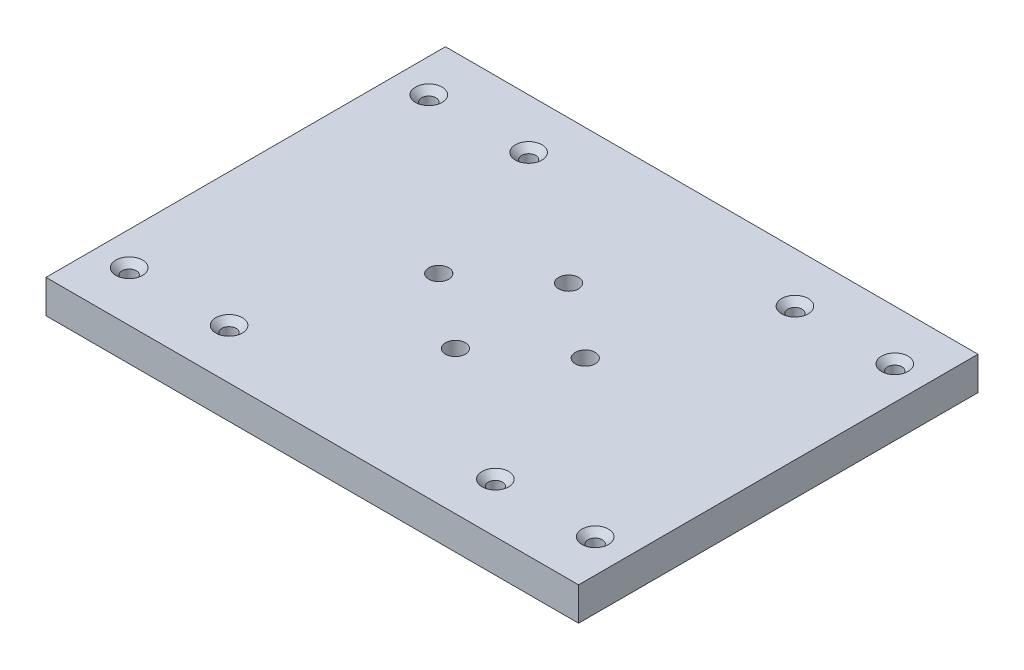
ISO-10303-21;
HEADER;
FILE_DESCRIPTION(('STEP AP214'),'2;1');
FILE_NAME('part.step','',(''),(''),'','','');
FILE_SCHEMA(('AUTOMOTIVE_DESIGN { 1 0 10303 214 1 1 1 1 }'));
ENDSEC;
DATA;
#1=APPLICATION_CONTEXT('core data for automotive mechanical design processes');
#2=APPLICATION_PROTOCOL_DEFINITION('international standard','automotive_design',2000,#1);
#3=PRODUCT_CONTEXT('',#1,'mechanical');
#4=PRODUCT('Part','Part','',(#3));
#5=PRODUCT_RELATED_PRODUCT_CATEGORY('part','',(#4));
#6=PRODUCT_DEFINITION_FORMATION('','',#4);
#7=PRODUCT_DEFINITION_CONTEXT('part definition',#1,'design');
#8=PRODUCT_DEFINITION('design','',#6,#7);
#9=PRODUCT_DEFINITION_SHAPE('','',#8);
#10=(LENGTH_UNIT() NAMED_UNIT(*) SI_UNIT(.MILLI.,.METRE.));
#11=(NAMED_UNIT(*) PLANE_ANGLE_UNIT() SI_UNIT($,.RADIAN.));
#12=(NAMED_UNIT(*) SI_UNIT($,.STERADIAN.) SOLID_ANGLE_UNIT());
#13=UNCERTAINTY_MEASURE_WITH_UNIT(LENGTH_MEASURE(1.E-05),#10,'distance_accuracy_value','');
#14=(GEOMETRIC_REPRESENTATION_CONTEXT(3) GLOBAL_UNCERTAINTY_ASSIGNED_CONTEXT((#13)) GLOBAL_UNIT_ASSIGNED_CONTEXT((#10,
#11,#12)) REPRESENTATION_CONTEXT('',''));
#15=CARTESIAN_POINT('',(0.,0.,0.));
#16=DIRECTION('',(0.,0.,1.));
#17=DIRECTION('',(1.,0.,0.));
#18=AXIS2_PLACEMENT_3D('',#15,#16,#17);
#19=CARTESIAN_POINT('',(-70.,9.99999999993406,-45.));
#20=DIRECTION('',(0.,1.,0.));
#21=DIRECTION('',(0.,0.,1.));
#22=AXIS2_PLACEMENT_3D('',#19,#20,#21);
#23=CONICAL_SURFACE('',#22,4.00000000000318,0.785398163397448);
#24=CARTESIAN_POINT('',(-70.,10.0000000000477,-45.));
#25=DIRECTION('',(0.,1.,0.));
#26=DIRECTION('',(0.,0.,1.));
#27=AXIS2_PLACEMENT_3D('',#24,#25,#26);
#28=CIRCLE('',#27,4.00000000011687);
#29=CARTESIAN_POINT('',(-70.,10.0000000000477,-40.9999999998831));
#30=VERTEX_POINT('',#29);
#31=EDGE_CURVE('E19',#30,#30,#28,.F.);
#32=ORIENTED_EDGE('',*,*,#31,.F.);
#33=EDGE_LOOP('',(#32));
#34=FACE_BOUND('',#33,.T.);
#35=CARTESIAN_POINT('',(-70.,8.15,-45.));
#36=DIRECTION('',(0.,1.,0.));
#37=DIRECTION('',(0.,0.,1.));
#38=AXIS2_PLACEMENT_3D('',#35,#36,#37);
#39=CIRCLE('',#38,2.15);
#40=CARTESIAN_POINT('',(-70.,8.15,-42.85));
#41=VERTEX_POINT('',#40);
#42=EDGE_CURVE('E129',#41,#41,#39,.F.);
#43=ORIENTED_EDGE('',*,*,#42,.T.);
#44=EDGE_LOOP('',(#43));
#45=FACE_BOUND('',#44,.T.);
#46=ADVANCED_FACE('F16',(#34,#45),#23,.F.);
#47=CARTESIAN_POINT('',(-40.,9.99999999999091,-45.));
#48=DIRECTION('',(0.,1.,0.));
#49=DIRECTION('',(0.,0.,1.));
#50=AXIS2_PLACEMENT_3D('',#47,#48,#49);
#51=CONICAL_SURFACE('',#50,4.00000000000318,0.785398163382085);
#52=CARTESIAN_POINT('',(-40.,9.99999999999091,-45.));
#53=DIRECTION('',(0.,1.,0.));
#54=DIRECTION('',(0.,0.,1.));
#55=AXIS2_PLACEMENT_3D('',#52,#53,#54);
#56=CIRCLE('',#55,4.00000000000318);
#57=CARTESIAN_POINT('',(-40.,9.99999999999091,-40.9999999999968));
#58=VERTEX_POINT('',#57);
#59=EDGE_CURVE('E192',#58,#58,#56,.F.);
#60=ORIENTED_EDGE('',*,*,#59,.F.);
#61=EDGE_LOOP('',(#60));
#62=FACE_BOUND('',#61,.T.);
#63=CARTESIAN_POINT('',(-40.,8.15,-45.));
#64=DIRECTION('',(0.,1.,0.));
#65=DIRECTION('',(0.,0.,1.));
#66=AXIS2_PLACEMENT_3D('',#63,#64,#65);
#67=CIRCLE('',#66,2.15);
#68=CARTESIAN_POINT('',(-40.,8.15,-42.85));
#69=VERTEX_POINT('',#68);
#70=EDGE_CURVE('E126',#69,#69,#67,.F.);
#71=ORIENTED_EDGE('',*,*,#70,.T.);
#72=EDGE_LOOP('',(#71));
#73=FACE_BOUND('',#72,.T.);
#74=ADVANCED_FACE('F202',(#62,#73),#51,.F.);
#75=CARTESIAN_POINT('',(40.,9.99999999999091,-45.0000000000001));
#76=DIRECTION('',(0.,1.,0.));
#77=DIRECTION('',(0.,0.,1.));
#78=AXIS2_PLACEMENT_3D('',#75,#76,#77);
#79=CONICAL_SURFACE('',#78,4.00000000000325,0.785398163382085);
#80=CARTESIAN_POINT('',(40.,9.99999999999091,-45.0000000000001));
#81=DIRECTION('',(0.,1.,0.));
#82=DIRECTION('',(0.,0.,1.));
#83=AXIS2_PLACEMENT_3D('',#80,#81,#82);
#84=CIRCLE('',#83,4.00000000000325);
#85=CARTESIAN_POINT('',(40.,9.99999999999091,-40.9999999999968));
#86=VERTEX_POINT('',#85);
#87=EDGE_CURVE('E190',#86,#86,#84,.F.);
#88=ORIENTED_EDGE('',*,*,#87,.F.);
#89=EDGE_LOOP('',(#88));
#90=FACE_BOUND('',#89,.T.);
#91=CARTESIAN_POINT('',(40.,8.15,-45.0000000000001));
#92=DIRECTION('',(0.,1.,0.));
#93=DIRECTION('',(0.,0.,1.));
#94=AXIS2_PLACEMENT_3D('',#91,#92,#93);
#95=CIRCLE('',#94,2.15);
#96=CARTESIAN_POINT('',(40.,8.15,-42.8500000000001));
#97=VERTEX_POINT('',#96);
#98=EDGE_CURVE('E123',#97,#97,#95,.F.);
#99=ORIENTED_EDGE('',*,*,#98,.T.);
#100=EDGE_LOOP('',(#99));
#101=FACE_BOUND('',#100,.T.);
#102=ADVANCED_FACE('F328',(#90,#101),#79,.F.);
#103=CARTESIAN_POINT('',(70.,9.99999999993406,-45.0000000000001));
#104=DIRECTION('',(0.,1.,0.));
#105=DIRECTION('',(0.,0.,1.));
#106=AXIS2_PLACEMENT_3D('',#103,#104,#105);
#107=CONICAL_SURFACE('',#106,4.00000000000329,0.785398163397448);
#108=CARTESIAN_POINT('',(70.,10.0000000000477,-45.0000000000001));
#109=DIRECTION('',(0.,1.,0.));
#110=DIRECTION('',(0.,0.,1.));
#111=AXIS2_PLACEMENT_3D('',#108,#109,#110);
#112=CIRCLE('',#111,4.00000000011697);
#113=CARTESIAN_POINT('',(70.,10.0000000000477,-40.9999999998831));
#114=VERTEX_POINT('',#113);
#115=EDGE_CURVE('E187',#114,#114,#112,.F.);
#116=ORIENTED_EDGE('',*,*,#115,.F.);
#117=EDGE_LOOP('',(#116));
#118=FACE_BOUND('',#117,.T.);
#119=CARTESIAN_POINT('',(70.,8.15,-45.0000000000001));
#120=DIRECTION('',(0.,1.,0.));
#121=DIRECTION('',(0.,0.,1.));
#122=AXIS2_PLACEMENT_3D('',#119,#120,#121);
#123=CIRCLE('',#122,2.15);
#124=CARTESIAN_POINT('',(70.,8.15,-42.8500000000001));
#125=VERTEX_POINT('',#124);
#126=EDGE_CURVE('E120',#125,#125,#123,.F.);
#127=ORIENTED_EDGE('',*,*,#126,.T.);
#128=EDGE_LOOP('',(#127));
#129=FACE_BOUND('',#128,.T.);
#130=ADVANCED_FACE('F324',(#118,#129),#107,.F.);
#131=CARTESIAN_POINT('',(70.,9.99999999987722,45.0000000000001));
#132=DIRECTION('',(0.,1.,0.));
#133=DIRECTION('',(0.,0.,1.));
#134=AXIS2_PLACEMENT_3D('',#131,#132,#133);
#135=CONICAL_SURFACE('',#134,3.99999999986442,0.785398163382085);
#136=CARTESIAN_POINT('',(70.,9.99999999999091,45.0000000000001));
#137=DIRECTION('',(0.,1.,0.));
#138=DIRECTION('',(0.,0.,1.));
#139=AXIS2_PLACEMENT_3D('',#136,#137,#138);
#140=CIRCLE('',#139,3.9999999999781);
#141=CARTESIAN_POINT('',(70.,9.99999999999091,48.9999999999782));
#142=VERTEX_POINT('',#141);
#143=EDGE_CURVE('E184',#142,#142,#140,.F.);
#144=ORIENTED_EDGE('',*,*,#143,.F.);
#145=EDGE_LOOP('',(#144));
#146=FACE_BOUND('',#145,.T.);
#147=CARTESIAN_POINT('',(70.,8.15,45.0000000000001));
#148=DIRECTION('',(0.,1.,0.));
#149=DIRECTION('',(0.,0.,1.));
#150=AXIS2_PLACEMENT_3D('',#147,#148,#149);
#151=CIRCLE('',#150,2.15);
#152=CARTESIAN_POINT('',(70.,8.15,47.1500000000001));
#153=VERTEX_POINT('',#152);
#154=EDGE_CURVE('E117',#153,#153,#151,.F.);
#155=ORIENTED_EDGE('',*,*,#154,.T.);
#156=EDGE_LOOP('',(#155));
#157=FACE_BOUND('',#156,.T.);
#158=ADVANCED_FACE('F320',(#146,#157),#135,.F.);
#159=CARTESIAN_POINT('',(40.,10.0000000000477,45.));
#160=DIRECTION('',(0.,1.,0.));
#161=DIRECTION('',(0.,0.,1.));
#162=AXIS2_PLACEMENT_3D('',#159,#160,#161);
#163=CONICAL_SURFACE('',#162,3.99999999997814,0.785398163382085);
#164=CARTESIAN_POINT('',(40.,10.0000000000477,45.));
#165=DIRECTION('',(0.,1.,0.));
#166=DIRECTION('',(0.,0.,1.));
#167=AXIS2_PLACEMENT_3D('',#164,#165,#166);
#168=CIRCLE('',#167,3.99999999997814);
#169=CARTESIAN_POINT('',(40.,10.0000000000477,48.9999999999782));
#170=VERTEX_POINT('',#169);
#171=EDGE_CURVE('E181',#170,#170,#168,.F.);
#172=ORIENTED_EDGE('',*,*,#171,.F.);
#173=EDGE_LOOP('',(#172));
#174=FACE_BOUND('',#173,.T.);
#175=CARTESIAN_POINT('',(40.,8.15,45.));
#176=DIRECTION('',(0.,1.,0.));
#177=DIRECTION('',(0.,0.,1.));
#178=AXIS2_PLACEMENT_3D('',#175,#176,#177);
#179=CIRCLE('',#178,2.15);
#180=CARTESIAN_POINT('',(40.,8.15,47.15));
#181=VERTEX_POINT('',#180);
#182=EDGE_CURVE('E114',#181,#181,#179,.F.);
#183=ORIENTED_EDGE('',*,*,#182,.T.);
#184=EDGE_LOOP('',(#183));
#185=FACE_BOUND('',#184,.T.);
#186=ADVANCED_FACE('F316',(#174,#185),#163,.F.);
#187=CARTESIAN_POINT('',(-40.,10.0000000000477,45.));
#188=DIRECTION('',(0.,1.,0.));
#189=DIRECTION('',(0.,0.,1.));
#190=AXIS2_PLACEMENT_3D('',#187,#188,#189);
#191=CONICAL_SURFACE('',#190,3.99999999997817,0.785398163382085);
#192=CARTESIAN_POINT('',(-40.,10.0000000000477,45.));
#193=DIRECTION('',(0.,1.,0.));
#194=DIRECTION('',(0.,0.,1.));
#195=AXIS2_PLACEMENT_3D('',#192,#193,#194);
#196=CIRCLE('',#195,3.99999999997817);
#197=CARTESIAN_POINT('',(-40.,10.0000000000477,48.9999999999782));
#198=VERTEX_POINT('',#197);
#199=EDGE_CURVE('E178',#198,#198,#196,.F.);
#200=ORIENTED_EDGE('',*,*,#199,.F.);
#201=EDGE_LOOP('',(#200));
#202=FACE_BOUND('',#201,.T.);
#203=CARTESIAN_POINT('',(-40.,8.15,45.));
#204=DIRECTION('',(0.,1.,0.));
#205=DIRECTION('',(0.,0.,1.));
#206=AXIS2_PLACEMENT_3D('',#203,#204,#205);
#207=CIRCLE('',#206,2.15);
#208=CARTESIAN_POINT('',(-40.,8.15,47.15));
#209=VERTEX_POINT('',#208);
#210=EDGE_CURVE('E111',#209,#209,#207,.F.);
#211=ORIENTED_EDGE('',*,*,#210,.T.);
#212=EDGE_LOOP('',(#211));
#213=FACE_BOUND('',#212,.T.);
#214=ADVANCED_FACE('F312',(#202,#213),#191,.F.);
#215=CARTESIAN_POINT('',(-70.,9.99999999987722,45.));
#216=DIRECTION('',(0.,1.,0.));
#217=DIRECTION('',(0.,0.,1.));
#218=AXIS2_PLACEMENT_3D('',#215,#216,#217);
#219=CONICAL_SURFACE('',#218,3.99999999986447,0.785398163382085);
#220=CARTESIAN_POINT('',(-70.,9.99999999999091,45.));
#221=DIRECTION('',(0.,1.,0.));
#222=DIRECTION('',(0.,0.,1.));
#223=AXIS2_PLACEMENT_3D('',#220,#221,#222);
#224=CIRCLE('',#223,3.99999999997816);
#225=CARTESIAN_POINT('',(-70.,9.99999999999091,48.9999999999782));
#226=VERTEX_POINT('',#225);
#227=EDGE_CURVE('E107',#226,#226,#224,.F.);
#228=ORIENTED_EDGE('',*,*,#227,.F.);
#229=EDGE_LOOP('',(#228));
#230=FACE_BOUND('',#229,.T.);
#231=CARTESIAN_POINT('',(-70.,8.15,45.));
#232=DIRECTION('',(0.,1.,0.));
#233=DIRECTION('',(0.,0.,1.));
#234=AXIS2_PLACEMENT_3D('',#231,#232,#233);
#235=CIRCLE('',#234,2.15);
#236=CARTESIAN_POINT('',(-70.,8.15,47.15));
#237=VERTEX_POINT('',#236);
#238=EDGE_CURVE('E108',#237,#237,#235,.F.);
#239=ORIENTED_EDGE('',*,*,#238,.T.);
#240=EDGE_LOOP('',(#239));
#241=FACE_BOUND('',#240,.T.);
#242=ADVANCED_FACE('F209',(#230,#241),#219,.F.);
#243=CARTESIAN_POINT('',(-70.,10.,-45.));
#244=DIRECTION('',(0.,1.,0.));
#245=DIRECTION('',(0.,0.,1.));
#246=AXIS2_PLACEMENT_3D('',#243,#244,#245);
#247=CYLINDRICAL_SURFACE('',#246,2.15);
#248=ORIENTED_EDGE('',*,*,#42,.F.);
#249=EDGE_LOOP('',(#248));
#250=FACE_BOUND('',#249,.T.);
#251=CARTESIAN_POINT('',(-70.,0.125000000025466,-45.));
#252=DIRECTION('',(0.,-1.,0.));
#253=DIRECTION('',(0.,0.,-1.));
#254=AXIS2_PLACEMENT_3D('',#251,#252,#253);
#255=CIRCLE('',#254,2.14999999998781);
#256=CARTESIAN_POINT('',(-70.,0.125000000025466,-47.1499999999878));
#257=VERTEX_POINT('',#256);
#258=EDGE_CURVE('E104',#257,#257,#255,.T.);
#259=ORIENTED_EDGE('',*,*,#258,.T.);
#260=EDGE_LOOP('',(#259));
#261=FACE_BOUND('',#260,.T.);
#262=ADVANCED_FACE('F205',(#250,#261),#247,.F.);
#263=CARTESIAN_POINT('',(-40.,10.,-45.));
#264=DIRECTION('',(0.,1.,0.));
#265=DIRECTION('',(0.,0.,1.));
#266=AXIS2_PLACEMENT_3D('',#263,#264,#265);
#267=CYLINDRICAL_SURFACE('',#266,2.15);
#268=ORIENTED_EDGE('',*,*,#70,.F.);
#269=EDGE_LOOP('',(#268));
#270=FACE_BOUND('',#269,.T.);
#271=CARTESIAN_POINT('',(-40.,0.125000000025466,-45.));
#272=DIRECTION('',(0.,-1.,0.));
#273=DIRECTION('',(0.,0.,-1.));
#274=AXIS2_PLACEMENT_3D('',#271,#272,#273);
#275=CIRCLE('',#274,2.14999999998781);
#276=CARTESIAN_POINT('',(-40.,0.125000000025466,-47.1499999999878));
#277=VERTEX_POINT('',#276);
#278=EDGE_CURVE('E101',#277,#277,#275,.T.);
#279=ORIENTED_EDGE('',*,*,#278,.T.);
#280=EDGE_LOOP('',(#279));
#281=FACE_BOUND('',#280,.T.);
#282=ADVANCED_FACE('F208',(#270,#281),#267,.F.);
#283=CARTESIAN_POINT('',(40.,10.,-45.0000000000001));
#284=DIRECTION('',(0.,1.,0.));
#285=DIRECTION('',(0.,0.,1.));
#286=AXIS2_PLACEMENT_3D('',#283,#284,#285);
#287=CYLINDRICAL_SURFACE('',#286,2.15);
#288=ORIENTED_EDGE('',*,*,#98,.F.);
#289=EDGE_LOOP('',(#288));
#290=FACE_BOUND('',#289,.T.);
#291=CARTESIAN_POINT('',(40.,0.125000000025466,-45.0000000000001));
#292=DIRECTION('',(0.,-1.,0.));
#293=DIRECTION('',(0.,0.,-1.));
#294=AXIS2_PLACEMENT_3D('',#291,#292,#293);
#295=CIRCLE('',#294,2.14999999998775);
#296=CARTESIAN_POINT('',(40.,0.125000000025466,-47.1499999999878));
#297=VERTEX_POINT('',#296);
#298=EDGE_CURVE('E98',#297,#297,#295,.T.);
#299=ORIENTED_EDGE('',*,*,#298,.T.);
#300=EDGE_LOOP('',(#299));
#301=FACE_BOUND('',#300,.T.);
#302=ADVANCED_FACE('F293',(#290,#301),#287,.F.);
#303=CARTESIAN_POINT('',(70.,10.,-45.0000000000001));
#304=DIRECTION('',(0.,1.,0.));
#305=DIRECTION('',(0.,0.,1.));
#306=AXIS2_PLACEMENT_3D('',#303,#304,#305);
#307=CYLINDRICAL_SURFACE('',#306,2.15);
#308=ORIENTED_EDGE('',*,*,#126,.F.);
#309=EDGE_LOOP('',(#308));
#310=FACE_BOUND('',#309,.T.);
#311=CARTESIAN_POINT('',(70.,0.125000000025466,-45.0000000000001));
#312=DIRECTION('',(0.,-1.,0.));
#313=DIRECTION('',(0.,0.,-1.));
#314=AXIS2_PLACEMENT_3D('',#311,#312,#313);
#315=CIRCLE('',#314,2.14999999998771);
#316=CARTESIAN_POINT('',(70.,0.125000000025466,-47.1499999999878));
#317=VERTEX_POINT('',#316);
#318=EDGE_CURVE('E95',#317,#317,#315,.T.);
#319=ORIENTED_EDGE('',*,*,#318,.T.);
#320=EDGE_LOOP('',(#319));
#321=FACE_BOUND('',#320,.T.);
#322=ADVANCED_FACE('F295',(#310,#321),#307,.F.);
#323=CARTESIAN_POINT('',(70.,10.,45.0000000000001));
#324=DIRECTION('',(0.,1.,0.));
#325=DIRECTION('',(0.,0.,1.));
#326=AXIS2_PLACEMENT_3D('',#323,#324,#325);
#327=CYLINDRICAL_SURFACE('',#326,2.15);
#328=ORIENTED_EDGE('',*,*,#154,.F.);
#329=EDGE_LOOP('',(#328));
#330=FACE_BOUND('',#329,.T.);
#331=CARTESIAN_POINT('',(70.,0.125000000025466,45.0000000000001));
#332=DIRECTION('',(0.,-1.,0.));
#333=DIRECTION('',(0.,0.,-1.));
#334=AXIS2_PLACEMENT_3D('',#331,#332,#333);
#335=CIRCLE('',#334,2.14999999995605);
#336=CARTESIAN_POINT('',(70.,0.125000000025466,42.850000000044));
#337=VERTEX_POINT('',#336);
#338=EDGE_CURVE('E92',#337,#337,#335,.T.);
#339=ORIENTED_EDGE('',*,*,#338,.T.);
#340=EDGE_LOOP('',(#339));
#341=FACE_BOUND('',#340,.T.);
#342=ADVANCED_FACE('F302',(#330,#341),#327,.F.);
#343=CARTESIAN_POINT('',(40.,10.,45.));
#344=DIRECTION('',(0.,1.,0.));
#345=DIRECTION('',(0.,0.,1.));
#346=AXIS2_PLACEMENT_3D('',#343,#344,#345);
#347=CYLINDRICAL_SURFACE('',#346,2.15);
#348=ORIENTED_EDGE('',*,*,#182,.F.);
#349=EDGE_LOOP('',(#348));
#350=FACE_BOUND('',#349,.T.);
#351=CARTESIAN_POINT('',(40.,0.125000000025466,45.));
#352=DIRECTION('',(0.,-1.,0.));
#353=DIRECTION('',(0.,0.,-1.));
#354=AXIS2_PLACEMENT_3D('',#351,#352,#353);
#355=CIRCLE('',#354,2.14999999995601);
#356=CARTESIAN_POINT('',(40.,0.125000000025466,42.850000000044));
#357=VERTEX_POINT('',#356);
#358=EDGE_CURVE('E89',#357,#357,#355,.T.);
#359=ORIENTED_EDGE('',*,*,#358,.T.);
#360=EDGE_LOOP('',(#359));
#361=FACE_BOUND('',#360,.T.);
#362=ADVANCED_FACE('F399',(#350,#361),#347,.F.);
#363=CARTESIAN_POINT('',(-40.,10.,45.));
#364=DIRECTION('',(0.,1.,0.));
#365=DIRECTION('',(0.,0.,1.));
#366=AXIS2_PLACEMENT_3D('',#363,#364,#365);
#367=CYLINDRICAL_SURFACE('',#366,2.15);
#368=ORIENTED_EDGE('',*,*,#210,.F.);
#369=EDGE_LOOP('',(#368));
#370=FACE_BOUND('',#369,.T.);
#371=CARTESIAN_POINT('',(-40.,0.125000000025466,45.));
#372=DIRECTION('',(0.,-1.,0.));
#373=DIRECTION('',(0.,0.,-1.));
#374=AXIS2_PLACEMENT_3D('',#371,#372,#373);
#375=CIRCLE('',#374,2.14999999995598);
#376=CARTESIAN_POINT('',(-40.,0.125000000025466,42.850000000044));
#377=VERTEX_POINT('',#376);
#378=EDGE_CURVE('E86',#377,#377,#375,.T.);
#379=ORIENTED_EDGE('',*,*,#378,.T.);
#380=EDGE_LOOP('',(#379));
#381=FACE_BOUND('',#380,.T.);
#382=ADVANCED_FACE('F408',(#370,#381),#367,.F.);
#383=CARTESIAN_POINT('',(-70.,10.,45.));
#384=DIRECTION('',(0.,1.,0.));
#385=DIRECTION('',(0.,0.,1.));
#386=AXIS2_PLACEMENT_3D('',#383,#384,#385);
#387=CYLINDRICAL_SURFACE('',#386,2.15);
#388=ORIENTED_EDGE('',*,*,#238,.F.);
#389=EDGE_LOOP('',(#388));
#390=FACE_BOUND('',#389,.T.);
#391=CARTESIAN_POINT('',(-70.,0.125000000025466,45.));
#392=DIRECTION('',(0.,-1.,0.));
#393=DIRECTION('',(0.,0.,-1.));
#394=AXIS2_PLACEMENT_3D('',#391,#392,#393);
#395=CIRCLE('',#394,2.14999999995599);
#396=CARTESIAN_POINT('',(-70.,0.125000000025466,42.850000000044));
#397=VERTEX_POINT('',#396);
#398=EDGE_CURVE('E82',#397,#397,#395,.T.);
#399=ORIENTED_EDGE('',*,*,#398,.T.);
#400=EDGE_LOOP('',(#399));
#401=FACE_BOUND('',#400,.T.);
#402=ADVANCED_FACE('F226',(#390,#401),#387,.F.);
#403=CARTESIAN_POINT('',(0.,10.,0.));
#404=DIRECTION('',(0.,1.,0.));
#405=DIRECTION('',(0.,0.,1.));
#406=AXIS2_PLACEMENT_3D('',#403,#404,#405);
#407=PLANE('',#406);
#408=CARTESIAN_POINT('',(0.,10.,17.));
#409=DIRECTION('',(0.,-1.,0.));
#410=DIRECTION('',(0.,0.,-1.));
#411=AXIS2_PLACEMENT_3D('',#408,#409,#410);
#412=CIRCLE('',#411,3.);
#413=CARTESIAN_POINT('',(0.,10.,14.));
#414=VERTEX_POINT('',#413);
#415=EDGE_CURVE('E165',#414,#414,#412,.T.);
#416=ORIENTED_EDGE('',*,*,#415,.T.);
#417=EDGE_LOOP('',(#416));
#418=FACE_BOUND('',#417,.T.);
#419=CARTESIAN_POINT('',(22.,10.,0.));
#420=DIRECTION('',(0.,-1.,0.));
#421=DIRECTION('',(0.,0.,-1.));
#422=AXIS2_PLACEMENT_3D('',#419,#420,#421);
#423=CIRCLE('',#422,3.);
#424=CARTESIAN_POINT('',(22.,10.,-3.));
#425=VERTEX_POINT('',#424);
#426=EDGE_CURVE('E168',#425,#425,#423,.T.);
#427=ORIENTED_EDGE('',*,*,#426,.T.);
#428=EDGE_LOOP('',(#427));
#429=FACE_BOUND('',#428,.T.);
#430=DIRECTION('',(0.,0.,1.));
#431=VECTOR('',#430,1.);
#432=CARTESIAN_POINT('',(80.,10.,60.));
#433=LINE('',#432,#431);
#434=CARTESIAN_POINT('',(80.,10.,60.));
#435=VERTEX_POINT('',#434);
#436=CARTESIAN_POINT('',(80.,10.,-60.));
#437=VERTEX_POINT('',#436);
#438=EDGE_CURVE('E55',#435,#437,#433,.F.);
#439=ORIENTED_EDGE('',*,*,#438,.T.);
#440=DIRECTION('',(1.,0.,0.));
#441=VECTOR('',#440,1.);
#442=CARTESIAN_POINT('',(80.,10.,-60.));
#443=LINE('',#442,#441);
#444=CARTESIAN_POINT('',(-80.,10.,-60.));
#445=VERTEX_POINT('',#444);
#446=EDGE_CURVE('E618',#437,#445,#443,.F.);
#447=ORIENTED_EDGE('',*,*,#446,.T.);
#448=DIRECTION('',(0.,0.,-1.));
#449=VECTOR('',#448,1.);
#450=CARTESIAN_POINT('',(-80.,10.,60.));
#451=LINE('',#450,#449);
#452=CARTESIAN_POINT('',(-80.,10.,60.));
#453=VERTEX_POINT('',#452);
#454=EDGE_CURVE('E61',#445,#453,#451,.F.);
#455=ORIENTED_EDGE('',*,*,#454,.T.);
#456=DIRECTION('',(-1.,0.,0.));
#457=VECTOR('',#456,1.);
#458=CARTESIAN_POINT('',(80.,10.,60.));
#459=LINE('',#458,#457);
#460=EDGE_CURVE('E58',#453,#435,#459,.F.);
#461=ORIENTED_EDGE('',*,*,#460,.T.);
#462=EDGE_LOOP('',(#439,#447,#455,#461));
#463=FACE_BOUND('',#462,.T.);
#464=CARTESIAN_POINT('',(0.,10.,-17.));
#465=DIRECTION('',(0.,-1.,0.));
#466=DIRECTION('',(0.,0.,-1.));
#467=AXIS2_PLACEMENT_3D('',#464,#465,#466);
#468=CIRCLE('',#467,3.);
#469=CARTESIAN_POINT('',(0.,10.,-20.));
#470=VERTEX_POINT('',#469);
#471=EDGE_CURVE('E67',#470,#470,#468,.T.);
#472=ORIENTED_EDGE('',*,*,#471,.T.);
#473=EDGE_LOOP('',(#472));
#474=FACE_BOUND('',#473,.T.);
#475=CARTESIAN_POINT('',(-22.,10.,0.));
#476=DIRECTION('',(0.,-1.,0.));
#477=DIRECTION('',(0.,0.,-1.));
#478=AXIS2_PLACEMENT_3D('',#475,#476,#477);
#479=CIRCLE('',#478,3.);
#480=CARTESIAN_POINT('',(-22.,10.,-3.));
#481=VERTEX_POINT('',#480);
#482=EDGE_CURVE('E85',#481,#481,#479,.T.);
#483=ORIENTED_EDGE('',*,*,#482,.T.);
#484=EDGE_LOOP('',(#483));
#485=FACE_BOUND('',#484,.T.);
#486=ORIENTED_EDGE('',*,*,#227,.T.);
#487=EDGE_LOOP('',(#486));
#488=FACE_BOUND('',#487,.T.);
#489=ORIENTED_EDGE('',*,*,#199,.T.);
#490=EDGE_LOOP('',(#489));
#491=FACE_BOUND('',#490,.T.);
#492=ORIENTED_EDGE('',*,*,#171,.T.);
#493=EDGE_LOOP('',(#492));
#494=FACE_BOUND('',#493,.T.);
#495=ORIENTED_EDGE('',*,*,#143,.T.);
#496=EDGE_LOOP('',(#495));
#497=FACE_BOUND('',#496,.T.);
#498=ORIENTED_EDGE('',*,*,#115,.T.);
#499=EDGE_LOOP('',(#498));
#500=FACE_BOUND('',#499,.T.);
#501=ORIENTED_EDGE('',*,*,#87,.T.);
#502=EDGE_LOOP('',(#501));
#503=FACE_BOUND('',#502,.T.);
#504=ORIENTED_EDGE('',*,*,#59,.T.);
#505=EDGE_LOOP('',(#504));
#506=FACE_BOUND('',#505,.T.);
#507=ORIENTED_EDGE('',*,*,#31,.T.);
#508=EDGE_LOOP('',(#507));
#509=FACE_BOUND('',#508,.T.);
#510=ADVANCED_FACE('F59',(#418,#429,#463,#474,#485,#488,#491,#494,#497,#500,#503,#506,#509),
#407,.T.);
#511=CARTESIAN_POINT('',(-70.,5.6843418860808E-11,-45.));
#512=DIRECTION('',(0.,-1.,0.));
#513=DIRECTION('',(0.,0.,-1.));
#514=AXIS2_PLACEMENT_3D('',#511,#512,#513);
#515=CONICAL_SURFACE('',#514,2.27500000001328,0.785398163624822);
#516=CARTESIAN_POINT('',(-70.,1.5917822634174E-11,-45.));
#517=DIRECTION('',(0.,-1.,0.));
#518=DIRECTION('',(0.,0.,-1.));
#519=AXIS2_PLACEMENT_3D('',#516,#517,#518);
#520=CIRCLE('',#519,2.27500000005421);
#521=CARTESIAN_POINT('',(-70.,1.5917822634174E-11,-47.2750000000542));
#522=VERTEX_POINT('',#521);
#523=EDGE_CURVE('E162',#522,#522,#520,.T.);
#524=ORIENTED_EDGE('',*,*,#523,.T.);
#525=EDGE_LOOP('',(#524));
#526=FACE_BOUND('',#525,.T.);
#527=ORIENTED_EDGE('',*,*,#258,.F.);
#528=EDGE_LOOP('',(#527));
#529=FACE_BOUND('',#528,.T.);
#530=ADVANCED_FACE('F213',(#526,#529),#515,.F.);
#531=CARTESIAN_POINT('',(-40.,5.6843418860808E-11,-45.));
#532=DIRECTION('',(0.,-1.,0.));
#533=DIRECTION('',(0.,0.,-1.));
#534=AXIS2_PLACEMENT_3D('',#531,#532,#533);
#535=CONICAL_SURFACE('',#534,2.27500000001328,0.785398163624822);
#536=CARTESIAN_POINT('',(-40.,1.5917822634174E-11,-45.));
#537=DIRECTION('',(0.,-1.,0.));
#538=DIRECTION('',(0.,0.,-1.));
#539=AXIS2_PLACEMENT_3D('',#536,#537,#538);
#540=CIRCLE('',#539,2.27500000005421);
#541=CARTESIAN_POINT('',(-40.,1.5917822634174E-11,-47.2750000000542));
#542=VERTEX_POINT('',#541);
#543=EDGE_CURVE('E159',#542,#542,#540,.T.);
#544=ORIENTED_EDGE('',*,*,#543,.T.);
#545=EDGE_LOOP('',(#544));
#546=FACE_BOUND('',#545,.T.);
#547=ORIENTED_EDGE('',*,*,#278,.F.);
#548=EDGE_LOOP('',(#547));
#549=FACE_BOUND('',#548,.T.);
#550=ADVANCED_FACE('F215',(#546,#549),#535,.F.);
#551=CARTESIAN_POINT('',(40.,5.6843418860808E-11,-45.0000000000001));
#552=DIRECTION('',(0.,-1.,0.));
#553=DIRECTION('',(0.,0.,-1.));
#554=AXIS2_PLACEMENT_3D('',#551,#552,#553);
#555=CONICAL_SURFACE('',#554,2.27500000001321,0.785398163624822);
#556=CARTESIAN_POINT('',(40.,1.58484336951665E-11,-45.0000000000001));
#557=DIRECTION('',(0.,-1.,0.));
#558=DIRECTION('',(0.,0.,-1.));
#559=AXIS2_PLACEMENT_3D('',#556,#557,#558);
#560=CIRCLE('',#559,2.27500000005421);
#561=CARTESIAN_POINT('',(40.,1.58484336951665E-11,-47.2750000000543));
#562=VERTEX_POINT('',#561);
#563=EDGE_CURVE('E156',#562,#562,#560,.T.);
#564=ORIENTED_EDGE('',*,*,#563,.T.);
#565=EDGE_LOOP('',(#564));
#566=FACE_BOUND('',#565,.T.);
#567=ORIENTED_EDGE('',*,*,#298,.F.);
#568=EDGE_LOOP('',(#567));
#569=FACE_BOUND('',#568,.T.);
#570=ADVANCED_FACE('F223',(#566,#569),#555,.F.);
#571=CARTESIAN_POINT('',(70.,5.6843418860808E-11,-45.0000000000001));
#572=DIRECTION('',(0.,-1.,0.));
#573=DIRECTION('',(0.,0.,-1.));
#574=AXIS2_PLACEMENT_3D('',#571,#572,#573);
#575=CONICAL_SURFACE('',#574,2.27500000001318,0.785398163624822);
#576=CARTESIAN_POINT('',(70.,1.58137392256627E-11,-45.0000000000001));
#577=DIRECTION('',(0.,-1.,0.));
#578=DIRECTION('',(0.,0.,-1.));
#579=AXIS2_PLACEMENT_3D('',#576,#577,#578);
#580=CIRCLE('',#579,2.27500000005421);
#581=CARTESIAN_POINT('',(70.,1.58137392256627E-11,-47.2750000000543));
#582=VERTEX_POINT('',#581);
#583=EDGE_CURVE('E153',#582,#582,#580,.T.);
#584=ORIENTED_EDGE('',*,*,#583,.T.);
#585=EDGE_LOOP('',(#584));
#586=FACE_BOUND('',#585,.T.);
#587=ORIENTED_EDGE('',*,*,#318,.F.);
#588=EDGE_LOOP('',(#587));
#589=FACE_BOUND('',#588,.T.);
#590=ADVANCED_FACE('F280',(#586,#589),#575,.F.);
#591=CARTESIAN_POINT('',(70.,5.6843418860808E-11,45.0000000000001));
#592=DIRECTION('',(0.,-1.,0.));
#593=DIRECTION('',(0.,0.,-1.));
#594=AXIS2_PLACEMENT_3D('',#591,#592,#593);
#595=CONICAL_SURFACE('',#594,2.27499999998151,0.785398163624822);
#596=CARTESIAN_POINT('',(70.,9.78384040264496E-11,45.0000000000001));
#597=DIRECTION('',(0.,-1.,0.));
#598=DIRECTION('',(0.,0.,-1.));
#599=AXIS2_PLACEMENT_3D('',#596,#597,#598);
#600=CIRCLE('',#599,2.27499999994052);
#601=CARTESIAN_POINT('',(70.,9.78384040264496E-11,42.7250000000596));
#602=VERTEX_POINT('',#601);
#603=EDGE_CURVE('E150',#602,#602,#600,.T.);
#604=ORIENTED_EDGE('',*,*,#603,.T.);
#605=EDGE_LOOP('',(#604));
#606=FACE_BOUND('',#605,.T.);
#607=ORIENTED_EDGE('',*,*,#338,.F.);
#608=EDGE_LOOP('',(#607));
#609=FACE_BOUND('',#608,.T.);
#610=ADVANCED_FACE('F276',(#606,#609),#595,.F.);
#611=CARTESIAN_POINT('',(40.,5.6843418860808E-11,45.));
#612=DIRECTION('',(0.,-1.,0.));
#613=DIRECTION('',(0.,0.,-1.));
#614=AXIS2_PLACEMENT_3D('',#611,#612,#613);
#615=CONICAL_SURFACE('',#614,2.27499999998148,0.785398163624822);
#616=CARTESIAN_POINT('',(40.,9.78037095569458E-11,45.));
#617=DIRECTION('',(0.,-1.,0.));
#618=DIRECTION('',(0.,0.,-1.));
#619=AXIS2_PLACEMENT_3D('',#616,#617,#618);
#620=CIRCLE('',#619,2.27499999994052);
#621=CARTESIAN_POINT('',(40.,9.78037095569458E-11,42.7250000000595));
#622=VERTEX_POINT('',#621);
#623=EDGE_CURVE('E147',#622,#622,#620,.T.);
#624=ORIENTED_EDGE('',*,*,#623,.T.);
#625=EDGE_LOOP('',(#624));
#626=FACE_BOUND('',#625,.T.);
#627=ORIENTED_EDGE('',*,*,#358,.F.);
#628=EDGE_LOOP('',(#627));
#629=FACE_BOUND('',#628,.T.);
#630=ADVANCED_FACE('F272',(#626,#629),#615,.F.);
#631=CARTESIAN_POINT('',(-40.,5.6843418860808E-11,45.));
#632=DIRECTION('',(0.,-1.,0.));
#633=DIRECTION('',(0.,0.,-1.));
#634=AXIS2_PLACEMENT_3D('',#631,#632,#633);
#635=CONICAL_SURFACE('',#634,2.27499999998144,0.785398163624822);
#636=CARTESIAN_POINT('',(-40.,9.7769015087442E-11,45.));
#637=DIRECTION('',(0.,-1.,0.));
#638=DIRECTION('',(0.,0.,-1.));
#639=AXIS2_PLACEMENT_3D('',#636,#637,#638);
#640=CIRCLE('',#639,2.27499999994052);
#641=CARTESIAN_POINT('',(-40.,9.7769015087442E-11,42.7250000000595));
#642=VERTEX_POINT('',#641);
#643=EDGE_CURVE('E144',#642,#642,#640,.T.);
#644=ORIENTED_EDGE('',*,*,#643,.T.);
#645=EDGE_LOOP('',(#644));
#646=FACE_BOUND('',#645,.T.);
#647=ORIENTED_EDGE('',*,*,#378,.F.);
#648=EDGE_LOOP('',(#647));
#649=FACE_BOUND('',#648,.T.);
#650=ADVANCED_FACE('F268',(#646,#649),#635,.F.);
#651=CARTESIAN_POINT('',(-70.,5.6843418860808E-11,45.));
#652=DIRECTION('',(0.,-1.,0.));
#653=DIRECTION('',(0.,0.,-1.));
#654=AXIS2_PLACEMENT_3D('',#651,#652,#653);
#655=CONICAL_SURFACE('',#654,2.27499999998146,0.785398163624822);
#656=CARTESIAN_POINT('',(-70.,9.77828928752435E-11,45.));
#657=DIRECTION('',(0.,-1.,0.));
#658=DIRECTION('',(0.,0.,-1.));
#659=AXIS2_PLACEMENT_3D('',#656,#657,#658);
#660=CIRCLE('',#659,2.27499999994052);
#661=CARTESIAN_POINT('',(-70.,9.77828928752435E-11,42.7250000000595));
#662=VERTEX_POINT('',#661);
#663=EDGE_CURVE('E141',#662,#662,#660,.T.);
#664=ORIENTED_EDGE('',*,*,#663,.T.);
#665=EDGE_LOOP('',(#664));
#666=FACE_BOUND('',#665,.T.);
#667=ORIENTED_EDGE('',*,*,#398,.F.);
#668=EDGE_LOOP('',(#667));
#669=FACE_BOUND('',#668,.T.);
#670=ADVANCED_FACE('F264',(#666,#669),#655,.F.);
#671=CARTESIAN_POINT('',(-22.,10.,0.));
#672=DIRECTION('',(0.,-1.,0.));
#673=DIRECTION('',(0.,0.,-1.));
#674=AXIS2_PLACEMENT_3D('',#671,#672,#673);
#675=CYLINDRICAL_SURFACE('',#674,3.);
#676=CARTESIAN_POINT('',(-22.,0.,0.));
#677=DIRECTION('',(0.,-1.,0.));
#678=DIRECTION('',(0.,0.,-1.));
#679=AXIS2_PLACEMENT_3D('',#676,#677,#678);
#680=CIRCLE('',#679,3.);
#681=CARTESIAN_POINT('',(-22.,0.,-3.));
#682=VERTEX_POINT('',#681);
#683=EDGE_CURVE('E138',#682,#682,#680,.T.);
#684=ORIENTED_EDGE('',*,*,#683,.T.);
#685=EDGE_LOOP('',(#684));
#686=FACE_BOUND('',#685,.T.);
#687=ORIENTED_EDGE('',*,*,#482,.F.);
#688=EDGE_LOOP('',(#687));
#689=FACE_BOUND('',#688,.T.);
#690=ADVANCED_FACE('F260',(#686,#689),#675,.F.);
#691=CARTESIAN_POINT('',(0.,10.,-17.));
#692=DIRECTION('',(0.,-1.,0.));
#693=DIRECTION('',(0.,0.,-1.));
#694=AXIS2_PLACEMENT_3D('',#691,#692,#693);
#695=CYLINDRICAL_SURFACE('',#694,3.);
#696=CARTESIAN_POINT('',(0.,0.,-17.));
#697=DIRECTION('',(0.,-1.,0.));
#698=DIRECTION('',(0.,0.,-1.));
#699=AXIS2_PLACEMENT_3D('',#696,#697,#698);
#700=CIRCLE('',#699,3.);
#701=CARTESIAN_POINT('',(0.,0.,-20.));
#702=VERTEX_POINT('',#701);
#703=EDGE_CURVE('E135',#702,#702,#700,.T.);
#704=ORIENTED_EDGE('',*,*,#703,.T.);
#705=EDGE_LOOP('',(#704));
#706=FACE_BOUND('',#705,.T.);
#707=ORIENTED_EDGE('',*,*,#471,.F.);
#708=EDGE_LOOP('',(#707));
#709=FACE_BOUND('',#708,.T.);
#710=ADVANCED_FACE('F257',(#706,#709),#695,.F.);
#711=CARTESIAN_POINT('',(80.,10.,60.));
#712=DIRECTION('',(0.,0.,-1.));
#713=DIRECTION('',(-1.,0.,0.));
#714=AXIS2_PLACEMENT_3D('',#711,#712,#713);
#715=PLANE('',#714);
#716=DIRECTION('',(0.,1.,0.));
#717=VECTOR('',#716,1.);
#718=CARTESIAN_POINT('',(80.,10.,60.));
#719=LINE('',#718,#717);
#720=CARTESIAN_POINT('',(80.,0.,60.));
#721=VERTEX_POINT('',#720);
#722=EDGE_CURVE('E66',#721,#435,#719,.T.);
#723=ORIENTED_EDGE('',*,*,#722,.T.);
#724=ORIENTED_EDGE('',*,*,#460,.F.);
#725=DIRECTION('',(0.,1.,0.));
#726=VECTOR('',#725,1.);
#727=CARTESIAN_POINT('',(-80.,10.,60.));
#728=LINE('',#727,#726);
#729=CARTESIAN_POINT('',(-80.,0.,60.));
#730=VERTEX_POINT('',#729);
#731=EDGE_CURVE('E171',#453,#730,#728,.F.);
#732=ORIENTED_EDGE('',*,*,#731,.T.);
#733=DIRECTION('',(1.,0.,0.));
#734=VECTOR('',#733,1.);
#735=CARTESIAN_POINT('',(0.,0.,60.));
#736=LINE('',#735,#734);
#737=EDGE_CURVE('E78',#730,#721,#736,.T.);
#738=ORIENTED_EDGE('',*,*,#737,.T.);
#739=EDGE_LOOP('',(#723,#724,#732,#738));
#740=FACE_BOUND('',#739,.T.);
#741=ADVANCED_FACE('F77',(#740),#715,.F.);
#742=CARTESIAN_POINT('',(80.,10.,60.));
#743=DIRECTION('',(-1.,0.,0.));
#744=DIRECTION('',(0.,0.,1.));
#745=AXIS2_PLACEMENT_3D('',#742,#743,#744);
#746=PLANE('',#745);
#747=DIRECTION('',(0.,1.,0.));
#748=VECTOR('',#747,1.);
#749=CARTESIAN_POINT('',(80.,10.,-60.));
#750=LINE('',#749,#748);
#751=CARTESIAN_POINT('',(80.,0.,-60.));
#752=VERTEX_POINT('',#751);
#753=EDGE_CURVE('E74',#752,#437,#750,.T.);
#754=ORIENTED_EDGE('',*,*,#753,.T.);
#755=ORIENTED_EDGE('',*,*,#438,.F.);
#756=ORIENTED_EDGE('',*,*,#722,.F.);
#757=DIRECTION('',(0.,0.,1.));
#758=VECTOR('',#757,1.);
#759=CARTESIAN_POINT('',(80.,0.,0.));
#760=LINE('',#759,#758);
#761=EDGE_CURVE('E627',#721,#752,#760,.F.);
#762=ORIENTED_EDGE('',*,*,#761,.T.);
#763=EDGE_LOOP('',(#754,#755,#756,#762));
#764=FACE_BOUND('',#763,.T.);
#765=ADVANCED_FACE('F71',(#764),#746,.F.);
#766=CARTESIAN_POINT('',(80.,10.,-60.));
#767=DIRECTION('',(0.,0.,1.));
#768=DIRECTION('',(1.,0.,0.));
#769=AXIS2_PLACEMENT_3D('',#766,#767,#768);
#770=PLANE('',#769);
#771=DIRECTION('',(0.,1.,0.));
#772=VECTOR('',#771,1.);
#773=CARTESIAN_POINT('',(-80.,10.,-60.));
#774=LINE('',#773,#772);
#775=CARTESIAN_POINT('',(-80.,0.,-60.));
#776=VERTEX_POINT('',#775);
#777=EDGE_CURVE('E34',#776,#445,#774,.T.);
#778=ORIENTED_EDGE('',*,*,#777,.T.);
#779=ORIENTED_EDGE('',*,*,#446,.F.);
#780=ORIENTED_EDGE('',*,*,#753,.F.);
#781=DIRECTION('',(1.,0.,0.));
#782=VECTOR('',#781,1.);
#783=CARTESIAN_POINT('',(0.,0.,-60.));
#784=LINE('',#783,#782);
#785=EDGE_CURVE('E620',#752,#776,#784,.F.);
#786=ORIENTED_EDGE('',*,*,#785,.T.);
#787=EDGE_LOOP('',(#778,#779,#780,#786));
#788=FACE_BOUND('',#787,.T.);
#789=ADVANCED_FACE('F249',(#788),#770,.F.);
#790=CARTESIAN_POINT('',(-80.,10.,60.));
#791=DIRECTION('',(1.,0.,0.));
#792=DIRECTION('',(0.,0.,-1.));
#793=AXIS2_PLACEMENT_3D('',#790,#791,#792);
#794=PLANE('',#793);
#795=ORIENTED_EDGE('',*,*,#731,.F.);
#796=ORIENTED_EDGE('',*,*,#454,.F.);
#797=ORIENTED_EDGE('',*,*,#777,.F.);
#798=DIRECTION('',(0.,0.,1.));
#799=VECTOR('',#798,1.);
#800=CARTESIAN_POINT('',(-80.,0.,0.));
#801=LINE('',#800,#799);
#802=EDGE_CURVE('E134',#776,#730,#801,.T.);
#803=ORIENTED_EDGE('',*,*,#802,.T.);
#804=EDGE_LOOP('',(#795,#796,#797,#803));
#805=FACE_BOUND('',#804,.T.);
#806=ADVANCED_FACE('F245',(#805),#794,.F.);
#807=CARTESIAN_POINT('',(22.,10.,0.));
#808=DIRECTION('',(0.,-1.,0.));
#809=DIRECTION('',(0.,0.,-1.));
#810=AXIS2_PLACEMENT_3D('',#807,#808,#809);
#811=CYLINDRICAL_SURFACE('',#810,3.);
#812=CARTESIAN_POINT('',(22.,0.,0.));
#813=DIRECTION('',(0.,-1.,0.));
#814=DIRECTION('',(0.,0.,-1.));
#815=AXIS2_PLACEMENT_3D('',#812,#813,#814);
#816=CIRCLE('',#815,3.);
#817=CARTESIAN_POINT('',(22.,0.,-3.));
#818=VERTEX_POINT('',#817);
#819=EDGE_CURVE('E25',#818,#818,#816,.T.);
#820=ORIENTED_EDGE('',*,*,#819,.T.);
#821=EDGE_LOOP('',(#820));
#822=FACE_BOUND('',#821,.T.);
#823=ORIENTED_EDGE('',*,*,#426,.F.);
#824=EDGE_LOOP('',(#823));
#825=FACE_BOUND('',#824,.T.);
#826=ADVANCED_FACE('F237',(#822,#825),#811,.F.);
#827=CARTESIAN_POINT('',(0.,10.,17.));
#828=DIRECTION('',(0.,-1.,0.));
#829=DIRECTION('',(0.,0.,-1.));
#830=AXIS2_PLACEMENT_3D('',#827,#828,#829);
#831=CYLINDRICAL_SURFACE('',#830,3.);
#832=CARTESIAN_POINT('',(0.,0.,17.));
#833=DIRECTION('',(0.,-1.,0.));
#834=DIRECTION('',(0.,0.,-1.));
#835=AXIS2_PLACEMENT_3D('',#832,#833,#834);
#836=CIRCLE('',#835,3.);
#837=CARTESIAN_POINT('',(0.,0.,14.));
#838=VERTEX_POINT('',#837);
#839=EDGE_CURVE('E10',#838,#838,#836,.T.);
#840=ORIENTED_EDGE('',*,*,#839,.T.);
#841=EDGE_LOOP('',(#840));
#842=FACE_BOUND('',#841,.T.);
#843=ORIENTED_EDGE('',*,*,#415,.F.);
#844=EDGE_LOOP('',(#843));
#845=FACE_BOUND('',#844,.T.);
#846=ADVANCED_FACE('F231',(#842,#845),#831,.F.);
#847=CARTESIAN_POINT('',(0.,0.,0.));
#848=DIRECTION('',(0.,1.,0.));
#849=DIRECTION('',(0.,0.,1.));
#850=AXIS2_PLACEMENT_3D('',#847,#848,#849);
#851=PLANE('',#850);
#852=ORIENTED_EDGE('',*,*,#839,.F.);
#853=EDGE_LOOP('',(#852));
#854=FACE_BOUND('',#853,.T.);
#855=ORIENTED_EDGE('',*,*,#819,.F.);
#856=EDGE_LOOP('',(#855));
#857=FACE_BOUND('',#856,.T.);
#858=ORIENTED_EDGE('',*,*,#785,.F.);
#859=ORIENTED_EDGE('',*,*,#761,.F.);
#860=ORIENTED_EDGE('',*,*,#737,.F.);
#861=ORIENTED_EDGE('',*,*,#802,.F.);
#862=EDGE_LOOP('',(#858,#859,#860,#861));
#863=FACE_BOUND('',#862,.T.);
#864=ORIENTED_EDGE('',*,*,#703,.F.);
#865=EDGE_LOOP('',(#864));
#866=FACE_BOUND('',#865,.T.);
#867=ORIENTED_EDGE('',*,*,#683,.F.);
#868=EDGE_LOOP('',(#867));
#869=FACE_BOUND('',#868,.T.);
#870=ORIENTED_EDGE('',*,*,#663,.F.);
#871=EDGE_LOOP('',(#870));
#872=FACE_BOUND('',#871,.T.);
#873=ORIENTED_EDGE('',*,*,#643,.F.);
#874=EDGE_LOOP('',(#873));
#875=FACE_BOUND('',#874,.T.);
#876=ORIENTED_EDGE('',*,*,#623,.F.);
#877=EDGE_LOOP('',(#876));
#878=FACE_BOUND('',#877,.T.);
#879=ORIENTED_EDGE('',*,*,#603,.F.);
#880=EDGE_LOOP('',(#879));
#881=FACE_BOUND('',#880,.T.);
#882=ORIENTED_EDGE('',*,*,#583,.F.);
#883=EDGE_LOOP('',(#882));
#884=FACE_BOUND('',#883,.T.);
#885=ORIENTED_EDGE('',*,*,#563,.F.);
#886=EDGE_LOOP('',(#885));
#887=FACE_BOUND('',#886,.T.);
#888=ORIENTED_EDGE('',*,*,#543,.F.);
#889=EDGE_LOOP('',(#888));
#890=FACE_BOUND('',#889,.T.);
#891=ORIENTED_EDGE('',*,*,#523,.F.);
#892=EDGE_LOOP('',(#891));
#893=FACE_BOUND('',#892,.T.);
#894=ADVANCED_FACE('F229',(#854,#857,#863,#866,#869,#872,#875,#878,#881,#884,#887,#890,#893),
#851,.F.);
#895=CLOSED_SHELL('',(#46,#74,#102,#130,#158,#186,#214,#242,#262,#282,#302,#322,#342,#362,#382,
#402,#510,#530,#550,#570,#590,#610,#630,#650,#670,#690,#710,#741,#765,#789,#806,#826,#846,#894));
#896=MANIFOLD_SOLID_BREP('B1',#895);
#897=ADVANCED_BREP_SHAPE_REPRESENTATION('',(#18,#896),#14);
#898=SHAPE_DEFINITION_REPRESENTATION(#9,#897);
ENDSEC;
END-ISO-10303-21;
